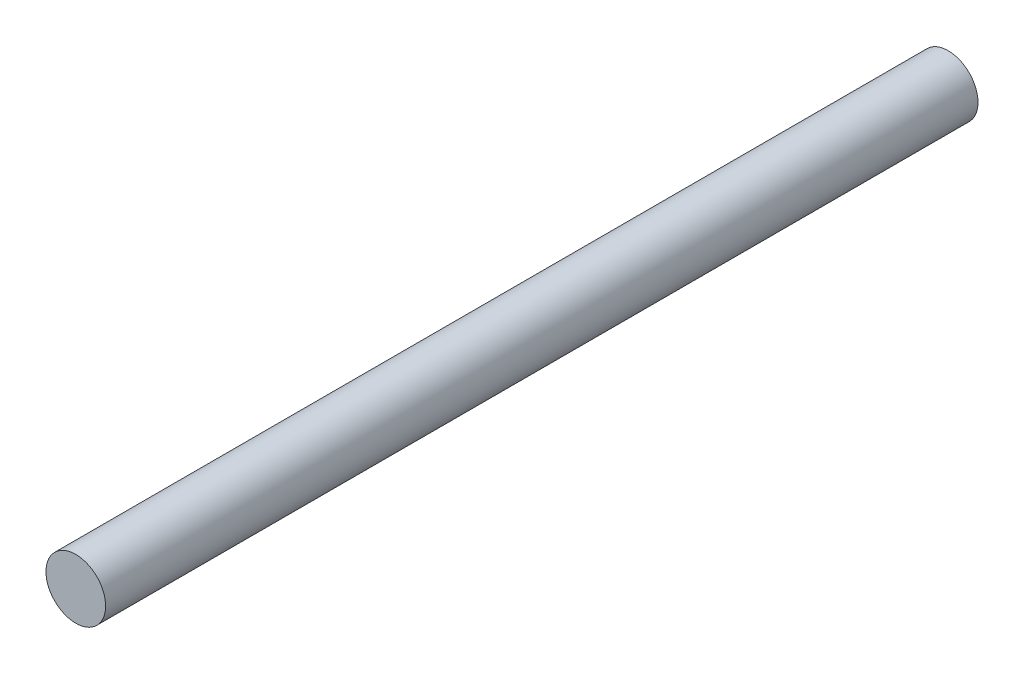
ISO-10303-21;
HEADER;
FILE_DESCRIPTION(('STEP AP214'),'2;1');
FILE_NAME('part.step','',(''),(''),'','','');
FILE_SCHEMA(('AUTOMOTIVE_DESIGN { 1 0 10303 214 1 1 1 1 }'));
ENDSEC;
DATA;
#1=APPLICATION_CONTEXT('core data for automotive mechanical design processes');
#2=APPLICATION_PROTOCOL_DEFINITION('international standard','automotive_design',2000,#1);
#3=PRODUCT_CONTEXT('',#1,'mechanical');
#4=PRODUCT('Part','Part','',(#3));
#5=PRODUCT_RELATED_PRODUCT_CATEGORY('part','',(#4));
#6=PRODUCT_DEFINITION_FORMATION('','',#4);
#7=PRODUCT_DEFINITION_CONTEXT('part definition',#1,'design');
#8=PRODUCT_DEFINITION('design','',#6,#7);
#9=PRODUCT_DEFINITION_SHAPE('','',#8);
#10=(LENGTH_UNIT() NAMED_UNIT(*) SI_UNIT(.MILLI.,.METRE.));
#11=(NAMED_UNIT(*) PLANE_ANGLE_UNIT() SI_UNIT($,.RADIAN.));
#12=(NAMED_UNIT(*) SI_UNIT($,.STERADIAN.) SOLID_ANGLE_UNIT());
#13=UNCERTAINTY_MEASURE_WITH_UNIT(LENGTH_MEASURE(1.E-05),#10,'distance_accuracy_value','');
#14=(GEOMETRIC_REPRESENTATION_CONTEXT(3) GLOBAL_UNCERTAINTY_ASSIGNED_CONTEXT((#13)) GLOBAL_UNIT_ASSIGNED_CONTEXT((#10,
#11,#12)) REPRESENTATION_CONTEXT('',''));
#15=CARTESIAN_POINT('',(0.,0.,0.));
#16=DIRECTION('',(0.,0.,1.));
#17=DIRECTION('',(1.,0.,0.));
#18=AXIS2_PLACEMENT_3D('',#15,#16,#17);
#19=CARTESIAN_POINT('',(0.,0.,117.));
#20=DIRECTION('',(0.,0.,-1.));
#21=DIRECTION('',(-1.,0.,0.));
#22=AXIS2_PLACEMENT_3D('',#19,#20,#21);
#23=CYLINDRICAL_SURFACE('',#22,4.);
#24=CARTESIAN_POINT('',(0.,0.,117.));
#25=DIRECTION('',(0.,0.,1.));
#26=DIRECTION('',(1.,0.,0.));
#27=AXIS2_PLACEMENT_3D('',#24,#25,#26);
#28=CIRCLE('',#27,4.);
#29=CARTESIAN_POINT('',(4.,0.,117.));
#30=VERTEX_POINT('',#29);
#31=EDGE_CURVE('E10',#30,#30,#28,.T.);
#32=ORIENTED_EDGE('',*,*,#31,.F.);
#33=EDGE_LOOP('',(#32));
#34=FACE_BOUND('',#33,.T.);
#35=CARTESIAN_POINT('',(0.,0.,0.));
#36=DIRECTION('',(0.,0.,1.));
#37=DIRECTION('',(1.,0.,0.));
#38=AXIS2_PLACEMENT_3D('',#35,#36,#37);
#39=CIRCLE('',#38,4.);
#40=CARTESIAN_POINT('',(4.,0.,0.));
#41=VERTEX_POINT('',#40);
#42=EDGE_CURVE('E45',#41,#41,#39,.T.);
#43=ORIENTED_EDGE('',*,*,#42,.T.);
#44=EDGE_LOOP('',(#43));
#45=FACE_BOUND('',#44,.T.);
#46=ADVANCED_FACE('F42',(#34,#45),#23,.T.);
#47=CARTESIAN_POINT('',(0.,0.,117.));
#48=DIRECTION('',(0.,0.,1.));
#49=DIRECTION('',(1.,0.,0.));
#50=AXIS2_PLACEMENT_3D('',#47,#48,#49);
#51=PLANE('',#50);
#52=ORIENTED_EDGE('',*,*,#31,.T.);
#53=EDGE_LOOP('',(#52));
#54=FACE_BOUND('',#53,.T.);
#55=ADVANCED_FACE('F59',(#54),#51,.T.);
#56=CARTESIAN_POINT('',(0.,0.,0.));
#57=DIRECTION('',(0.,0.,1.));
#58=DIRECTION('',(1.,0.,0.));
#59=AXIS2_PLACEMENT_3D('',#56,#57,#58);
#60=PLANE('',#59);
#61=ORIENTED_EDGE('',*,*,#42,.F.);
#62=EDGE_LOOP('',(#61));
#63=FACE_BOUND('',#62,.T.);
#64=ADVANCED_FACE('F57',(#63),#60,.F.);
#65=CLOSED_SHELL('',(#46,#55,#64));
#66=MANIFOLD_SOLID_BREP('B2',#65);
#67=ADVANCED_BREP_SHAPE_REPRESENTATION('',(#18,#66),#14);
#68=SHAPE_DEFINITION_REPRESENTATION(#9,#67);
ENDSEC;
END-ISO-10303-21;
